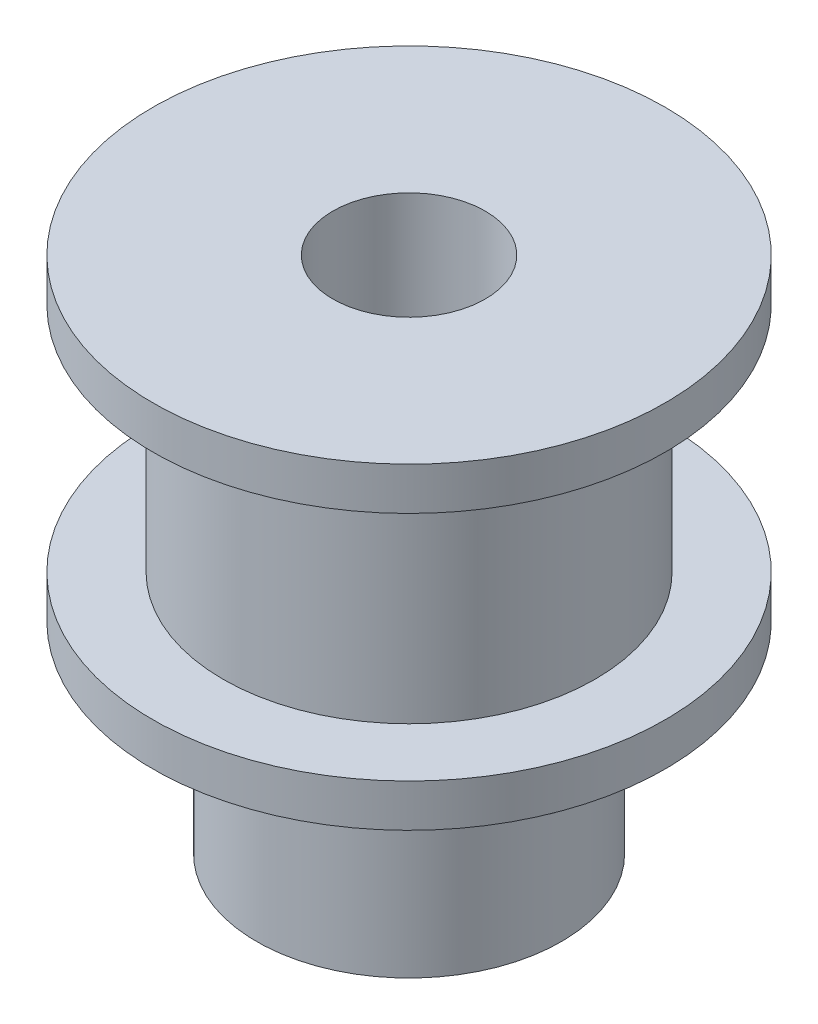
ISO-10303-21;
HEADER;
FILE_DESCRIPTION(('STEP AP214'),'2;1');
FILE_NAME('part.step','',(''),(''),'','','');
FILE_SCHEMA(('AUTOMOTIVE_DESIGN { 1 0 10303 214 1 1 1 1 }'));
ENDSEC;
DATA;
#1=APPLICATION_CONTEXT('core data for automotive mechanical design processes');
#2=APPLICATION_PROTOCOL_DEFINITION('international standard','automotive_design',2000,#1);
#3=PRODUCT_CONTEXT('',#1,'mechanical');
#4=PRODUCT('Part','Part','',(#3));
#5=PRODUCT_RELATED_PRODUCT_CATEGORY('part','',(#4));
#6=PRODUCT_DEFINITION_FORMATION('','',#4);
#7=PRODUCT_DEFINITION_CONTEXT('part definition',#1,'design');
#8=PRODUCT_DEFINITION('design','',#6,#7);
#9=PRODUCT_DEFINITION_SHAPE('','',#8);
#10=(LENGTH_UNIT() NAMED_UNIT(*) SI_UNIT(.MILLI.,.METRE.));
#11=(NAMED_UNIT(*) PLANE_ANGLE_UNIT() SI_UNIT($,.RADIAN.));
#12=(NAMED_UNIT(*) SI_UNIT($,.STERADIAN.) SOLID_ANGLE_UNIT());
#13=UNCERTAINTY_MEASURE_WITH_UNIT(LENGTH_MEASURE(1.E-05),#10,'distance_accuracy_value','');
#14=(GEOMETRIC_REPRESENTATION_CONTEXT(3) GLOBAL_UNCERTAINTY_ASSIGNED_CONTEXT((#13)) GLOBAL_UNIT_ASSIGNED_CONTEXT((#10,
#11,#12)) REPRESENTATION_CONTEXT('',''));
#15=CARTESIAN_POINT('',(0.,0.,0.));
#16=DIRECTION('',(0.,0.,1.));
#17=DIRECTION('',(1.,0.,0.));
#18=AXIS2_PLACEMENT_3D('',#15,#16,#17);
#19=CARTESIAN_POINT('',(0.,0.,0.));
#20=DIRECTION('',(0.,-1.,0.));
#21=DIRECTION('',(0.,0.,-1.));
#22=AXIS2_PLACEMENT_3D('',#19,#20,#21);
#23=CYLINDRICAL_SURFACE('',#22,2.5);
#24=CARTESIAN_POINT('',(2.16506350946109,5.,1.25000000000001));
#25=CARTESIAN_POINT('',(2.16506918410573,4.93486523975594,1.24999545384317));
#26=CARTESIAN_POINT('',(2.16804751484695,4.86964823559369,1.24487496341653));
#27=CARTESIAN_POINT('',(2.17952958065065,4.74121591915356,1.22465401237257));
#28=CARTESIAN_POINT('',(2.18804492569449,4.67800510619574,1.20953258069273));
#29=CARTESIAN_POINT('',(2.20936683256748,4.55568541957007,1.17012493587477));
#30=CARTESIAN_POINT('',(2.22215054341565,4.49655668440802,1.14588744061717));
#31=CARTESIAN_POINT('',(2.25053331021072,4.3832197475041,1.08908440672047));
#32=CARTESIAN_POINT('',(2.2661325184508,4.32901181217193,1.05651841754472));
#33=CARTESIAN_POINT('',(2.29996086321801,4.22211783930312,0.980833175663607));
#34=CARTESIAN_POINT('',(2.31830079547442,4.16992608040807,0.937065045179721));
#35=CARTESIAN_POINT('',(2.35464978482132,4.07323951449161,0.841567259518094));
#36=CARTESIAN_POINT('',(2.37265867289062,4.0287485467706,0.789833657227875));
#37=CARTESIAN_POINT('',(2.40776846191186,3.94579106106542,0.675611954268192));
#38=CARTESIAN_POINT('',(2.42472633022715,3.90793279017559,0.612633986265728));
#39=CARTESIAN_POINT('',(2.45438445124411,3.8435739334428,0.480196283249389));
#40=CARTESIAN_POINT('',(2.46708738979677,3.81706617982854,0.410740672672703));
#41=CARTESIAN_POINT('',(2.48600576555297,3.77811917337363,0.272556179907481));
#42=CARTESIAN_POINT('',(2.49261850276115,3.76481309205558,0.204127238111031));
#43=CARTESIAN_POINT('',(2.50009479807584,3.7497923516562,0.0657132858723195));
#44=CARTESIAN_POINT('',(2.50096183480737,3.74807067900536,-0.00427075730466375));
#45=CARTESIAN_POINT('',(2.49703727395563,3.75593334246294,-0.137290655529678));
#46=CARTESIAN_POINT('',(2.49273119865201,3.76454751940153,-0.20040149897098));
#47=CARTESIAN_POINT('',(2.47967806574684,3.79110105488082,-0.324142214897893));
#48=CARTESIAN_POINT('',(2.47093067582992,3.80904111122028,-0.384771901367398));
#49=CARTESIAN_POINT('',(2.44964479109568,3.85385320761227,-0.502886739461933));
#50=CARTESIAN_POINT('',(2.43705551911499,3.88084539146508,-0.560316779393964));
#51=CARTESIAN_POINT('',(2.40922057483359,3.94282927025187,-0.669971001891652));
#52=CARTESIAN_POINT('',(2.39397395196855,3.97782382912794,-0.722193311048298));
#53=CARTESIAN_POINT('',(2.36055492999037,4.05861918941627,-0.825217076122735));
#54=CARTESIAN_POINT('',(2.34224219997719,4.10512878540751,-0.875417593786692));
#55=CARTESIAN_POINT('',(2.30567925733515,4.20573715616272,-0.967630462872217));
#56=CARTESIAN_POINT('',(2.28742910332036,4.25984171534258,-1.00963651446778));
#57=CARTESIAN_POINT('',(2.25180195115606,4.37831024053011,-1.08688166830276));
#58=CARTESIAN_POINT('',(2.23455399988385,4.44310752881776,-1.12152164372256));
#59=CARTESIAN_POINT('',(2.2046931284822,4.57867208919875,-1.17914889125153));
#60=CARTESIAN_POINT('',(2.19207537557585,4.64943304127195,-1.2021483227636));
#61=CARTESIAN_POINT('',(2.17430794771293,4.78901813910349,-1.23397526378129));
#62=CARTESIAN_POINT('',(2.16864569810621,4.85755139880444,-1.24378140264996));
#63=CARTESIAN_POINT('',(2.16397399202012,4.99550167689568,-1.25189618326428));
#64=CARTESIAN_POINT('',(2.1649598361164,5.06491803639973,-1.25021294664377));
#65=CARTESIAN_POINT('',(2.17292920675731,5.19456739822341,-1.23629505417995));
#66=CARTESIAN_POINT('',(2.17924484383318,5.25497431388491,-1.22523477089058));
#67=CARTESIAN_POINT('',(2.19617526939177,5.3729597328387,-1.19462035579054));
#68=CARTESIAN_POINT('',(2.20679145006293,5.43053731343326,-1.17506347327951));
#69=CARTESIAN_POINT('',(2.23170277599571,5.54426416362837,-1.1270594857561));
#70=CARTESIAN_POINT('',(2.24614554053829,5.60022377106694,-1.0982425796159));
#71=CARTESIAN_POINT('',(2.27695149371562,5.70683658942374,-1.03285883001975));
#72=CARTESIAN_POINT('',(2.29331566693935,5.7574870543916,-0.996288005415263));
#73=CARTESIAN_POINT('',(2.3285999807042,5.85872345940443,-0.91104645899856));
#74=CARTESIAN_POINT('',(2.34758228942862,5.90849643839707,-0.861431590393701));
#75=CARTESIAN_POINT('',(2.38417793722366,5.99926529749199,-0.754255619247854));
#76=CARTESIAN_POINT('',(2.40179081259637,6.04025821278817,-0.696691843319177));
#77=CARTESIAN_POINT('',(2.43426702113696,6.11321715743763,-0.573169203198439));
#78=CARTESIAN_POINT('',(2.44904552090037,6.14491639776364,-0.507028871967634));
#79=CARTESIAN_POINT('',(2.47354193699126,6.19642237982174,-0.369402955801345));
#80=CARTESIAN_POINT('',(2.48326429595466,6.21623956420788,-0.297922126740212));
#81=CARTESIAN_POINT('',(2.49584385227353,6.24171070521833,-0.158724602913014));
#82=CARTESIAN_POINT('',(2.49924909885239,6.24849734484514,-0.0912643048130636));
#83=CARTESIAN_POINT('',(2.50052662968914,6.251054081818,0.0439074824390123));
#84=CARTESIAN_POINT('',(2.49840085083612,6.24682803565446,0.111618875368866));
#85=CARTESIAN_POINT('',(2.48917461047403,6.22822949150547,0.240672490396442));
#86=CARTESIAN_POINT('',(2.48241118334987,6.21454393842791,0.302140397264088));
#87=CARTESIAN_POINT('',(2.46490117079279,6.17834125087129,0.42180744022953));
#88=CARTESIAN_POINT('',(2.45415401415994,6.15582284988318,0.480006106194394));
#89=CARTESIAN_POINT('',(2.4290741343515,6.10159118479253,0.594279257806113));
#90=CARTESIAN_POINT('',(2.41460771498499,6.0695258459902,0.650156428375065));
#91=CARTESIAN_POINT('',(2.38360166427282,5.99755258642619,0.755968302267538));
#92=CARTESIAN_POINT('',(2.3670610819795,5.95764106360541,0.805900259268642));
#93=CARTESIAN_POINT('',(2.33160762783284,5.86650357622162,0.903642505196122));
#94=CARTESIAN_POINT('',(2.31262248764622,5.81454689065351,0.950747105674097));
#95=CARTESIAN_POINT('',(2.27578845203565,5.70318659858779,1.03582910924335));
#96=CARTESIAN_POINT('',(2.25794057202331,5.6437764739154,1.07379843751258));
#97=CARTESIAN_POINT('',(2.22499506631145,5.51670419177381,1.14053884973208));
#98=CARTESIAN_POINT('',(2.21000217820337,5.44884058608908,1.16898133245118));
#99=CARTESIAN_POINT('',(2.18582695410439,5.30833449457528,1.21359838688302));
#100=CARTESIAN_POINT('',(2.17662520184627,5.23570888885914,1.22981398896919));
#101=CARTESIAN_POINT('',(2.16911590752238,5.13524330543501,1.24295875983053));
#102=CARTESIAN_POINT('',(2.16760161256439,5.10829013200265,1.24559513120482));
#103=CARTESIAN_POINT('',(2.16557419859687,5.0542293991472,1.24911675636246));
#104=CARTESIAN_POINT('',(2.16506114656386,5.02712182951766,1.25000189299985));
#105=CARTESIAN_POINT('',(2.16506350946109,5.,1.25000000000001));
#106=B_SPLINE_CURVE_WITH_KNOTS('',3,(#24,#25,#26,#27,#28,#29,#30,#31,#32,#33,#34,#35,#36,#37,
#38,#39,#40,#41,#42,#43,#44,#45,#46,#47,#48,#49,#50,#51,#52,#53,#54,#55,#56,#57,#58,#59,#60,#61,
#62,#63,#64,#65,#66,#67,#68,#69,#70,#71,#72,#73,#74,#75,#76,#77,#78,#79,#80,#81,#82,#83,#84,#85,
#86,#87,#88,#89,#90,#91,#92,#93,#94,#95,#96,#97,#98,#99,#100,#101,#102,#103,#104,#105),
.UNSPECIFIED.,.T.,.F.,(4,2,2,2,2,2,2,2,2,2,2,2,2,2,2,2,2,2,2,2,2,2,2,2,2,2,2,2,2,2,2,2,2,2,2,2,
2,2,2,2,4),(0.,0.195290153243395,0.390991116031006,0.585660744898608,0.780340906806437,
0.991077890622793,1.20191963855464,1.42697365298454,1.65188533704864,1.86079356209919,
2.0695752960755,2.26020121855673,2.45084140646819,2.64411918413933,2.8374662418784,
3.04908989321113,3.26087560307398,3.48611052161811,3.71110967764631,3.91827863567765,
4.12530116485466,4.30967729280032,4.49411315545079,4.6870912050761,4.88016857775059,
5.09758429475766,5.31507331222753,5.53830226766207,5.76133474760965,5.96390337986859,
6.16640108492465,6.35555531089366,6.54473666890016,6.7420093839934,6.93937287625899,
7.15637802312584,7.37357428556443,7.59763436298256,7.8209391625345,7.90225168981637,
7.98356965618176),.UNSPECIFIED.);
#107=CARTESIAN_POINT('',(2.16506350946109,5.,1.25000000000001));
#108=VERTEX_POINT('',#107);
#109=EDGE_CURVE('E102',#108,#108,#106,.T.);
#110=ORIENTED_EDGE('',*,*,#109,.T.);
#111=EDGE_LOOP('',(#110));
#112=FACE_BOUND('',#111,.T.);
#113=CARTESIAN_POINT('',(1.25,5.,-2.1650635094611));
#114=CARTESIAN_POINT('',(1.24999545384316,4.93486523975594,-2.16506918410574));
#115=CARTESIAN_POINT('',(1.24487496341652,4.86964823559369,-2.16804751484696));
#116=CARTESIAN_POINT('',(1.22465401237257,4.74121591915356,-2.17952958065065));
#117=CARTESIAN_POINT('',(1.20953258069272,4.67800510619574,-2.18804492569449));
#118=CARTESIAN_POINT('',(1.17012493587477,4.55568541957007,-2.20936683256748));
#119=CARTESIAN_POINT('',(1.14588744061716,4.49655668440802,-2.22215054341565));
#120=CARTESIAN_POINT('',(1.08908440672047,4.3832197475041,-2.25053331021072));
#121=CARTESIAN_POINT('',(1.05651841754472,4.32901181217193,-2.26613251845081));
#122=CARTESIAN_POINT('',(0.980833175663598,4.22211783930312,-2.29996086321802));
#123=CARTESIAN_POINT('',(0.937065045179713,4.16992608040807,-2.31830079547442));
#124=CARTESIAN_POINT('',(0.841567259518085,4.07323951449161,-2.35464978482132));
#125=CARTESIAN_POINT('',(0.789833657227866,4.0287485467706,-2.37265867289062));
#126=CARTESIAN_POINT('',(0.675611954268182,3.94579106106542,-2.40776846191186));
#127=CARTESIAN_POINT('',(0.612633986265718,3.90793279017559,-2.42472633022716));
#128=CARTESIAN_POINT('',(0.48019628324938,3.8435739334428,-2.45438445124411));
#129=CARTESIAN_POINT('',(0.410740672672694,3.81706617982854,-2.46708738979677));
#130=CARTESIAN_POINT('',(0.272556179907472,3.77811917337363,-2.48600576555297));
#131=CARTESIAN_POINT('',(0.204127238111022,3.76481309205558,-2.49261850276115));
#132=CARTESIAN_POINT('',(0.0657132858723103,3.7497923516562,-2.50009479807584));
#133=CARTESIAN_POINT('',(-0.00427075730467304,3.74807067900536,-2.50096183480737));
#134=CARTESIAN_POINT('',(-0.137290655529687,3.75593334246294,-2.49703727395563));
#135=CARTESIAN_POINT('',(-0.200401498970989,3.76454751940153,-2.492731198652));
#136=CARTESIAN_POINT('',(-0.324142214897902,3.79110105488082,-2.47967806574684));
#137=CARTESIAN_POINT('',(-0.384771901367407,3.80904111122028,-2.47093067582992));
#138=CARTESIAN_POINT('',(-0.502886739461942,3.85385320761227,-2.44964479109568));
#139=CARTESIAN_POINT('',(-0.560316779393973,3.88084539146508,-2.43705551911499));
#140=CARTESIAN_POINT('',(-0.669971001891661,3.94282927025187,-2.40922057483359));
#141=CARTESIAN_POINT('',(-0.722193311048307,3.97782382912794,-2.39397395196855));
#142=CARTESIAN_POINT('',(-0.825217076122744,4.05861918941627,-2.36055492999036));
#143=CARTESIAN_POINT('',(-0.875417593786701,4.10512878540751,-2.34224219997719));
#144=CARTESIAN_POINT('',(-0.967630462872225,4.20573715616272,-2.30567925733515));
#145=CARTESIAN_POINT('',(-1.00963651446779,4.25984171534258,-2.28742910332036));
#146=CARTESIAN_POINT('',(-1.08688166830276,4.37831024053011,-2.25180195115606));
#147=CARTESIAN_POINT('',(-1.12152164372256,4.44310752881776,-2.23455399988384));
#148=CARTESIAN_POINT('',(-1.17914889125154,4.57867208919875,-2.2046931284822));
#149=CARTESIAN_POINT('',(-1.20214832276361,4.64943304127195,-2.19207537557584));
#150=CARTESIAN_POINT('',(-1.2339752637813,4.78901813910349,-2.17430794771293));
#151=CARTESIAN_POINT('',(-1.24378140264997,4.85755139880444,-2.1686456981062));
#152=CARTESIAN_POINT('',(-1.25189618326428,4.99550167689568,-2.16397399202012));
#153=CARTESIAN_POINT('',(-1.25021294664378,5.06491803639973,-2.16495983611639));
#154=CARTESIAN_POINT('',(-1.23629505417996,5.19456739822341,-2.17292920675731));
#155=CARTESIAN_POINT('',(-1.22523477089058,5.25497431388491,-2.17924484383318));
#156=CARTESIAN_POINT('',(-1.19462035579055,5.3729597328387,-2.19617526939176));
#157=CARTESIAN_POINT('',(-1.17506347327952,5.43053731343326,-2.20679145006292));
#158=CARTESIAN_POINT('',(-1.12705948575611,5.54426416362837,-2.23170277599571));
#159=CARTESIAN_POINT('',(-1.0982425796159,5.60022377106694,-2.24614554053829));
#160=CARTESIAN_POINT('',(-1.03285883001976,5.70683658942374,-2.27695149371562));
#161=CARTESIAN_POINT('',(-0.996288005415271,5.7574870543916,-2.29331566693934));
#162=CARTESIAN_POINT('',(-0.911046458998567,5.85872345940444,-2.3285999807042));
#163=CARTESIAN_POINT('',(-0.861431590393709,5.90849643839707,-2.34758228942861));
#164=CARTESIAN_POINT('',(-0.754255619247861,5.99926529749199,-2.38417793722366));
#165=CARTESIAN_POINT('',(-0.696691843319184,6.04025821278818,-2.40179081259637));
#166=CARTESIAN_POINT('',(-0.573169203198446,6.11321715743763,-2.43426702113696));
#167=CARTESIAN_POINT('',(-0.507028871967641,6.14491639776364,-2.44904552090037));
#168=CARTESIAN_POINT('',(-0.369402955801352,6.19642237982174,-2.47354193699126));
#169=CARTESIAN_POINT('',(-0.29792212674022,6.21623956420788,-2.48326429595466));
#170=CARTESIAN_POINT('',(-0.158724602913021,6.24171070521833,-2.49584385227353));
#171=CARTESIAN_POINT('',(-0.0912643048130714,6.24849734484514,-2.49924909885239));
#172=CARTESIAN_POINT('',(0.0439074824390044,6.251054081818,-2.50052662968914));
#173=CARTESIAN_POINT('',(0.111618875368858,6.24682803565446,-2.49840085083612));
#174=CARTESIAN_POINT('',(0.240672490396434,6.22822949150547,-2.48917461047403));
#175=CARTESIAN_POINT('',(0.30214039726408,6.21454393842791,-2.48241118334987));
#176=CARTESIAN_POINT('',(0.421807440229522,6.17834125087129,-2.46490117079279));
#177=CARTESIAN_POINT('',(0.480006106194386,6.15582284988318,-2.45415401415995));
#178=CARTESIAN_POINT('',(0.594279257806106,6.10159118479253,-2.4290741343515));
#179=CARTESIAN_POINT('',(0.650156428375059,6.0695258459902,-2.41460771498499));
#180=CARTESIAN_POINT('',(0.755968302267532,5.99755258642619,-2.38360166427283));
#181=CARTESIAN_POINT('',(0.805900259268634,5.95764106360541,-2.36706108197951));
#182=CARTESIAN_POINT('',(0.903642505196114,5.86650357622162,-2.33160762783285));
#183=CARTESIAN_POINT('',(0.95074710567409,5.81454689065351,-2.31262248764622));
#184=CARTESIAN_POINT('',(1.03582910924334,5.70318659858779,-2.27578845203565));
#185=CARTESIAN_POINT('',(1.07379843751257,5.6437764739154,-2.25794057202332));
#186=CARTESIAN_POINT('',(1.14053884973207,5.51670419177381,-2.22499506631145));
#187=CARTESIAN_POINT('',(1.16898133245117,5.44884058608908,-2.21000217820338));
#188=CARTESIAN_POINT('',(1.21359838688301,5.30833449457528,-2.18582695410439));
#189=CARTESIAN_POINT('',(1.22981398896918,5.23570888885914,-2.17662520184627));
#190=CARTESIAN_POINT('',(1.24295875983052,5.135243305435,-2.16911590752238));
#191=CARTESIAN_POINT('',(1.24559513120481,5.10829013200265,-2.1676016125644));
#192=CARTESIAN_POINT('',(1.24911675636245,5.0542293991472,-2.16557419859688));
#193=CARTESIAN_POINT('',(1.25000189299984,5.02712182951766,-2.16506114656387));
#194=CARTESIAN_POINT('',(1.25,5.,-2.1650635094611));
#195=B_SPLINE_CURVE_WITH_KNOTS('',3,(#113,#114,#115,#116,#117,#118,#119,#120,#121,#122,#123,
#124,#125,#126,#127,#128,#129,#130,#131,#132,#133,#134,#135,#136,#137,#138,#139,#140,#141,#142,
#143,#144,#145,#146,#147,#148,#149,#150,#151,#152,#153,#154,#155,#156,#157,#158,#159,#160,#161,
#162,#163,#164,#165,#166,#167,#168,#169,#170,#171,#172,#173,#174,#175,#176,#177,#178,#179,#180,
#181,#182,#183,#184,#185,#186,#187,#188,#189,#190,#191,#192,#193,#194),.UNSPECIFIED.,.T.,.F.,(4,
2,2,2,2,2,2,2,2,2,2,2,2,2,2,2,2,2,2,2,2,2,2,2,2,2,2,2,2,2,2,2,2,2,2,2,2,2,2,2,4),(0.,
0.195290153243395,0.390991116031006,0.585660744898607,0.780340906806438,0.991077890622794,
1.20191963855464,1.42697365298454,1.65188533704864,1.86079356209919,2.0695752960755,
2.26020121855673,2.45084140646819,2.64411918413933,2.8374662418784,3.04908989321113,
3.26087560307398,3.48611052161811,3.71110967764631,3.91827863567765,4.12530116485466,
4.30967729280032,4.49411315545079,4.6870912050761,4.88016857775059,5.09758429475767,
5.31507331222753,5.53830226766207,5.76133474760965,5.96390337986859,6.16640108492465,
6.35555531089366,6.54473666890016,6.7420093839934,6.93937287625899,7.15637802312585,
7.37357428556443,7.59763436298256,7.82093916253451,7.90225168981637,7.98356965618176),.UNSPECIFIED.);
#196=CARTESIAN_POINT('',(1.25,5.,-2.1650635094611));
#197=VERTEX_POINT('',#196);
#198=EDGE_CURVE('E72',#197,#197,#195,.T.);
#199=ORIENTED_EDGE('',*,*,#198,.T.);
#200=EDGE_LOOP('',(#199));
#201=FACE_BOUND('',#200,.T.);
#202=CARTESIAN_POINT('',(0.,0.,0.));
#203=DIRECTION('',(0.,-1.,0.));
#204=DIRECTION('',(0.,0.,-1.));
#205=AXIS2_PLACEMENT_3D('',#202,#203,#204);
#206=CIRCLE('',#205,2.5);
#207=CARTESIAN_POINT('',(0.,0.,-2.5));
#208=VERTEX_POINT('',#207);
#209=EDGE_CURVE('E69',#208,#208,#206,.T.);
#210=ORIENTED_EDGE('',*,*,#209,.T.);
#211=EDGE_LOOP('',(#210));
#212=FACE_BOUND('',#211,.T.);
#213=CARTESIAN_POINT('',(0.,17.,0.));
#214=DIRECTION('',(0.,-1.,0.));
#215=DIRECTION('',(0.,0.,-1.));
#216=AXIS2_PLACEMENT_3D('',#213,#214,#215);
#217=CIRCLE('',#216,2.5);
#218=CARTESIAN_POINT('',(0.,17.,-2.5));
#219=VERTEX_POINT('',#218);
#220=EDGE_CURVE('E10',#219,#219,#217,.T.);
#221=ORIENTED_EDGE('',*,*,#220,.F.);
#222=EDGE_LOOP('',(#221));
#223=FACE_BOUND('',#222,.T.);
#224=ADVANCED_FACE('F35',(#112,#201,#212,#223),#23,.F.);
#225=CARTESIAN_POINT('',(2.5,17.,0.));
#226=DIRECTION('',(0.,1.,0.));
#227=DIRECTION('',(0.,0.,1.));
#228=AXIS2_PLACEMENT_3D('',#225,#226,#227);
#229=PLANE('',#228);
#230=ORIENTED_EDGE('',*,*,#220,.T.);
#231=EDGE_LOOP('',(#230));
#232=FACE_BOUND('',#231,.T.);
#233=CARTESIAN_POINT('',(0.,17.,0.));
#234=DIRECTION('',(0.,-1.,0.));
#235=DIRECTION('',(0.,0.,-1.));
#236=AXIS2_PLACEMENT_3D('',#233,#234,#235);
#237=CIRCLE('',#236,8.4);
#238=CARTESIAN_POINT('',(0.,17.,-8.4));
#239=VERTEX_POINT('',#238);
#240=EDGE_CURVE('E41',#239,#239,#237,.T.);
#241=ORIENTED_EDGE('',*,*,#240,.F.);
#242=EDGE_LOOP('',(#241));
#243=FACE_BOUND('',#242,.T.);
#244=ADVANCED_FACE('F131',(#232,#243),#229,.T.);
#245=CARTESIAN_POINT('',(0.,0.,0.));
#246=DIRECTION('',(0.,-1.,0.));
#247=DIRECTION('',(0.,0.,-1.));
#248=AXIS2_PLACEMENT_3D('',#245,#246,#247);
#249=CYLINDRICAL_SURFACE('',#248,8.4);
#250=ORIENTED_EDGE('',*,*,#240,.T.);
#251=EDGE_LOOP('',(#250));
#252=FACE_BOUND('',#251,.T.);
#253=CARTESIAN_POINT('',(0.,15.6,0.));
#254=DIRECTION('',(0.,-1.,0.));
#255=DIRECTION('',(0.,0.,-1.));
#256=AXIS2_PLACEMENT_3D('',#253,#254,#255);
#257=CIRCLE('',#256,8.4);
#258=CARTESIAN_POINT('',(0.,15.6,-8.4));
#259=VERTEX_POINT('',#258);
#260=EDGE_CURVE('E45',#259,#259,#257,.T.);
#261=ORIENTED_EDGE('',*,*,#260,.F.);
#262=EDGE_LOOP('',(#261));
#263=FACE_BOUND('',#262,.T.);
#264=ADVANCED_FACE('F135',(#252,#263),#249,.T.);
#265=CARTESIAN_POINT('',(8.4,15.6,0.));
#266=DIRECTION('',(0.,-1.,0.));
#267=DIRECTION('',(0.,0.,-1.));
#268=AXIS2_PLACEMENT_3D('',#265,#266,#267);
#269=PLANE('',#268);
#270=ORIENTED_EDGE('',*,*,#260,.T.);
#271=EDGE_LOOP('',(#270));
#272=FACE_BOUND('',#271,.T.);
#273=CARTESIAN_POINT('',(0.,15.6,0.));
#274=DIRECTION('',(0.,-1.,0.));
#275=DIRECTION('',(0.,0.,-1.));
#276=AXIS2_PLACEMENT_3D('',#273,#274,#275);
#277=CIRCLE('',#276,6.1);
#278=CARTESIAN_POINT('',(0.,15.6,-6.1));
#279=VERTEX_POINT('',#278);
#280=EDGE_CURVE('E49',#279,#279,#277,.T.);
#281=ORIENTED_EDGE('',*,*,#280,.F.);
#282=EDGE_LOOP('',(#281));
#283=FACE_BOUND('',#282,.T.);
#284=ADVANCED_FACE('F209',(#272,#283),#269,.T.);
#285=CARTESIAN_POINT('',(0.,0.,0.));
#286=DIRECTION('',(0.,-1.,0.));
#287=DIRECTION('',(0.,0.,-1.));
#288=AXIS2_PLACEMENT_3D('',#285,#286,#287);
#289=CYLINDRICAL_SURFACE('',#288,6.1);
#290=ORIENTED_EDGE('',*,*,#280,.T.);
#291=EDGE_LOOP('',(#290));
#292=FACE_BOUND('',#291,.T.);
#293=CARTESIAN_POINT('',(0.,8.,0.));
#294=DIRECTION('',(0.,-1.,0.));
#295=DIRECTION('',(0.,0.,-1.));
#296=AXIS2_PLACEMENT_3D('',#293,#294,#295);
#297=CIRCLE('',#296,6.1);
#298=CARTESIAN_POINT('',(0.,8.,-6.1));
#299=VERTEX_POINT('',#298);
#300=EDGE_CURVE('E54',#299,#299,#297,.T.);
#301=ORIENTED_EDGE('',*,*,#300,.F.);
#302=EDGE_LOOP('',(#301));
#303=FACE_BOUND('',#302,.T.);
#304=ADVANCED_FACE('F199',(#292,#303),#289,.T.);
#305=CARTESIAN_POINT('',(6.1,8.,0.));
#306=DIRECTION('',(0.,1.,0.));
#307=DIRECTION('',(0.,0.,1.));
#308=AXIS2_PLACEMENT_3D('',#305,#306,#307);
#309=PLANE('',#308);
#310=ORIENTED_EDGE('',*,*,#300,.T.);
#311=EDGE_LOOP('',(#310));
#312=FACE_BOUND('',#311,.T.);
#313=CARTESIAN_POINT('',(0.,8.,0.));
#314=DIRECTION('',(0.,-1.,0.));
#315=DIRECTION('',(0.,0.,-1.));
#316=AXIS2_PLACEMENT_3D('',#313,#314,#315);
#317=CIRCLE('',#316,8.4);
#318=CARTESIAN_POINT('',(0.,8.,-8.4));
#319=VERTEX_POINT('',#318);
#320=EDGE_CURVE('E57',#319,#319,#317,.T.);
#321=ORIENTED_EDGE('',*,*,#320,.F.);
#322=EDGE_LOOP('',(#321));
#323=FACE_BOUND('',#322,.T.);
#324=ADVANCED_FACE('F189',(#312,#323),#309,.T.);
#325=CARTESIAN_POINT('',(0.,0.,0.));
#326=DIRECTION('',(0.,-1.,0.));
#327=DIRECTION('',(0.,0.,-1.));
#328=AXIS2_PLACEMENT_3D('',#325,#326,#327);
#329=CYLINDRICAL_SURFACE('',#328,8.4);
#330=ORIENTED_EDGE('',*,*,#320,.T.);
#331=EDGE_LOOP('',(#330));
#332=FACE_BOUND('',#331,.T.);
#333=CARTESIAN_POINT('',(0.,6.6,0.));
#334=DIRECTION('',(0.,-1.,0.));
#335=DIRECTION('',(0.,0.,-1.));
#336=AXIS2_PLACEMENT_3D('',#333,#334,#335);
#337=CIRCLE('',#336,8.4);
#338=CARTESIAN_POINT('',(0.,6.6,-8.4));
#339=VERTEX_POINT('',#338);
#340=EDGE_CURVE('E60',#339,#339,#337,.T.);
#341=ORIENTED_EDGE('',*,*,#340,.F.);
#342=EDGE_LOOP('',(#341));
#343=FACE_BOUND('',#342,.T.);
#344=ADVANCED_FACE('F179',(#332,#343),#329,.T.);
#345=CARTESIAN_POINT('',(8.4,6.6,0.));
#346=DIRECTION('',(0.,-1.,0.));
#347=DIRECTION('',(0.,0.,-1.));
#348=AXIS2_PLACEMENT_3D('',#345,#346,#347);
#349=PLANE('',#348);
#350=ORIENTED_EDGE('',*,*,#340,.T.);
#351=EDGE_LOOP('',(#350));
#352=FACE_BOUND('',#351,.T.);
#353=CARTESIAN_POINT('',(0.,6.6,0.));
#354=DIRECTION('',(0.,-1.,0.));
#355=DIRECTION('',(0.,0.,-1.));
#356=AXIS2_PLACEMENT_3D('',#353,#354,#355);
#357=CIRCLE('',#356,5.);
#358=CARTESIAN_POINT('',(0.,6.6,-5.));
#359=VERTEX_POINT('',#358);
#360=EDGE_CURVE('E63',#359,#359,#357,.T.);
#361=ORIENTED_EDGE('',*,*,#360,.F.);
#362=EDGE_LOOP('',(#361));
#363=FACE_BOUND('',#362,.T.);
#364=ADVANCED_FACE('F117',(#352,#363),#349,.T.);
#365=CARTESIAN_POINT('',(0.,0.,0.));
#366=DIRECTION('',(0.,-1.,0.));
#367=DIRECTION('',(0.,0.,-1.));
#368=AXIS2_PLACEMENT_3D('',#365,#366,#367);
#369=CYLINDRICAL_SURFACE('',#368,5.);
#370=CARTESIAN_POINT('',(4.84122918275927,5.,1.25000000000002));
#371=CARTESIAN_POINT('',(4.84123050042654,5.0690253754623,1.24999803929591));
#372=CARTESIAN_POINT('',(4.84272153006956,5.138072449339,1.24426312274867));
#373=CARTESIAN_POINT('',(4.84850930996624,5.27418378908702,1.22151156273209));
#374=CARTESIAN_POINT('',(4.85280769310906,5.34124687723416,1.20448835337112));
#375=CARTESIAN_POINT('',(4.86369362297983,5.47140176909352,1.15974559981599));
#376=CARTESIAN_POINT('',(4.87027821345204,5.53449857769284,1.13203986392725));
#377=CARTESIAN_POINT('',(4.88499096014404,5.65515542626996,1.06676057063072));
#378=CARTESIAN_POINT('',(4.89311918189251,5.71271523104011,1.02918659428036));
#379=CARTESIAN_POINT('',(4.91020358177805,5.8219308226311,0.944354213655954));
#380=CARTESIAN_POINT('',(4.91917298811515,5.87344680017502,0.896918443852042));
#381=CARTESIAN_POINT('',(4.93681437757648,5.96788069718017,0.794091032050349));
#382=CARTESIAN_POINT('',(4.94548633283194,6.01079781281087,0.738698647090171));
#383=CARTESIAN_POINT('',(4.96170207760291,6.08738773381564,0.620572600539494));
#384=CARTESIAN_POINT('',(4.96922843700296,6.12092319408073,0.557747288097577));
#385=CARTESIAN_POINT('',(4.98215405962992,6.17690482207654,0.427131592146399));
#386=CARTESIAN_POINT('',(4.98755363667172,6.19935262595776,0.359341942895988));
#387=CARTESIAN_POINT('',(4.9955237942409,6.23207391728929,0.222179379377098));
#388=CARTESIAN_POINT('',(4.99814946922157,6.24258482216329,0.152866359774505));
#389=CARTESIAN_POINT('',(5.00046797053649,6.25187918963778,0.0134144096314023));
#390=CARTESIAN_POINT('',(5.00016123048352,6.2506643861048,-0.0567243972690167));
#391=CARTESIAN_POINT('',(4.99669047476767,6.23671257487493,-0.194190308965467));
#392=CARTESIAN_POINT('',(4.99359001170437,6.22423183747307,-0.261545269501316));
#393=CARTESIAN_POINT('',(4.98495418262427,6.18851436497575,-0.393172809267091));
#394=CARTESIAN_POINT('',(4.97941868699221,6.1652770573113,-0.45744522421303));
#395=CARTESIAN_POINT('',(4.96643754850448,6.10849871465647,-0.581758379377241));
#396=CARTESIAN_POINT('',(4.95897509847527,6.07486647766913,-0.641755637208114));
#397=CARTESIAN_POINT('',(4.94294951904825,5.99832216044187,-0.755344527925594));
#398=CARTESIAN_POINT('',(4.93438619826245,5.95540846571969,-0.808935043856865));
#399=CARTESIAN_POINT('',(4.91681856884761,5.86014562900881,-0.909717543856178));
#400=CARTESIAN_POINT('',(4.90780859762959,5.80757255382611,-0.956697098843982));
#401=CARTESIAN_POINT('',(4.89057521758354,5.69520001322987,-1.04122046995376));
#402=CARTESIAN_POINT('',(4.88235184552986,5.6354002102545,-1.0787638450575));
#403=CARTESIAN_POINT('',(4.86760248415825,5.50985498292552,-1.14348516127823));
#404=CARTESIAN_POINT('',(4.86108491862861,5.4440821348434,-1.1706119587131));
#405=CARTESIAN_POINT('',(4.85059320069979,5.30870726596177,-1.21335702579541));
#406=CARTESIAN_POINT('',(4.8466185040511,5.23910606800843,-1.22897775819112));
#407=CARTESIAN_POINT('',(4.84177678019571,5.10002024923844,-1.24791481933257));
#408=CARTESIAN_POINT('',(4.84083044546825,5.03058110333519,-1.2515452369598));
#409=CARTESIAN_POINT('',(4.8419367174052,4.89208903171092,-1.24725849525776));
#410=CARTESIAN_POINT('',(4.84398904800633,4.82303607102438,-1.23934239892438));
#411=CARTESIAN_POINT('',(4.85078540977281,4.68844286752265,-1.21246273196881));
#412=CARTESIAN_POINT('',(4.85548485117188,4.62286363671458,-1.19368203414086));
#413=CARTESIAN_POINT('',(4.86700359135482,4.49578427107416,-1.14580904083529));
#414=CARTESIAN_POINT('',(4.87382314124307,4.43428462047233,-1.11671552385626));
#415=CARTESIAN_POINT('',(4.88898068546632,4.31577936106633,-1.04838533396826));
#416=CARTESIAN_POINT('',(4.89734584303321,4.25888557997845,-1.0089608769178));
#417=CARTESIAN_POINT('',(4.91458541535858,4.15240581859932,-0.921325366168052));
#418=CARTESIAN_POINT('',(4.92345991364235,4.10282104167496,-0.873112868506782));
#419=CARTESIAN_POINT('',(4.94098701515803,4.01109447871452,-0.76782840123089));
#420=CARTESIAN_POINT('',(4.94962851030918,3.96916996872559,-0.710564940664473));
#421=CARTESIAN_POINT('',(4.96548608306867,3.89553206652438,-0.589628353368327));
#422=CARTESIAN_POINT('',(4.9727022350198,3.8638181416959,-0.525955561196972));
#423=CARTESIAN_POINT('',(4.98485057869157,3.81177698273603,-0.394447752163845));
#424=CARTESIAN_POINT('',(4.98979915011205,3.79136785781047,-0.326646726284834));
#425=CARTESIAN_POINT('',(4.99692646697894,3.76226983269579,-0.188437200398492));
#426=CARTESIAN_POINT('',(4.99910574696704,3.75357867063047,-0.118029206301537));
#427=CARTESIAN_POINT('',(5.00042711761014,3.74829051303058,0.0213544080541753));
#428=CARTESIAN_POINT('',(4.9996497360001,3.75137286363076,0.0903172837075587));
#429=CARTESIAN_POINT('',(4.9953237057178,3.76880978411791,0.226709370518442));
#430=CARTESIAN_POINT('',(4.99177513946369,3.78316401876638,0.294138627226125));
#431=CARTESIAN_POINT('',(4.98231791067453,3.82256527471366,0.425213794556037));
#432=CARTESIAN_POINT('',(4.97642205628333,3.84755431664328,0.488878118226291));
#433=CARTESIAN_POINT('',(4.9628911114173,3.90746322377416,0.611146316301853));
#434=CARTESIAN_POINT('',(4.9552558017217,3.94238434083696,0.669749551581331));
#435=CARTESIAN_POINT('',(4.93884062101666,4.02214404249634,0.781752410529891));
#436=CARTESIAN_POINT('',(4.93003771182014,4.06720017863422,0.834993735375747));
#437=CARTESIAN_POINT('',(4.91238311316552,4.16552856496725,0.933268775339085));
#438=CARTESIAN_POINT('',(4.90353141190695,4.21880289512238,0.978300406335254));
#439=CARTESIAN_POINT('',(4.88659344825685,4.33325176775166,1.05970253309905));
#440=CARTESIAN_POINT('',(4.87852454662355,4.39455515426578,1.0958957743082));
#441=CARTESIAN_POINT('',(4.86429944438269,4.52256936240338,1.1574086207696));
#442=CARTESIAN_POINT('',(4.85814185308378,4.58927620763343,1.18273613719967));
#443=CARTESIAN_POINT('',(4.84939885924729,4.7132212647834,1.21802816070682));
#444=CARTESIAN_POINT('',(4.84635828750683,4.76986645547982,1.22999146324424));
#445=CARTESIAN_POINT('',(4.84227298231965,4.88433608624995,1.2459778657166));
#446=CARTESIAN_POINT('',(4.84122807862453,4.94216042530633,1.25000164296525));
#447=CARTESIAN_POINT('',(4.84122918275927,5.,1.25000000000002));
#448=B_SPLINE_CURVE_WITH_KNOTS('',3,(#370,#371,#372,#373,#374,#375,#376,#377,#378,#379,#380,
#381,#382,#383,#384,#385,#386,#387,#388,#389,#390,#391,#392,#393,#394,#395,#396,#397,#398,#399,
#400,#401,#402,#403,#404,#405,#406,#407,#408,#409,#410,#411,#412,#413,#414,#415,#416,#417,#418,
#419,#420,#421,#422,#423,#424,#425,#426,#427,#428,#429,#430,#431,#432,#433,#434,#435,#436,#437,
#438,#439,#440,#441,#442,#443,#444,#445,#446,#447),.UNSPECIFIED.,.T.,.F.,(4,2,2,2,2,2,2,2,2,2,2,
2,2,2,2,2,2,2,2,2,2,2,2,2,2,2,2,2,2,2,2,2,2,2,2,2,2,2,4),(0.,0.206863720868067,
0.413847870714333,0.620565363583011,0.827291633777393,1.03811977096488,1.24896760739933,
1.4627574819896,1.67651579923546,1.88594375497673,2.0953407433301,2.30009131344474,
2.50485278362393,2.71146437127222,2.91811192734457,3.13035233285956,3.34260265599901,
3.55588216004201,3.76911600064774,3.97671787380859,4.18430063591901,4.38848702504604,
4.59269760710709,4.80091422929579,5.00916509442522,5.2226266548266,5.43607707859777,
5.64796036403465,5.85980274454519,6.06591723063728,6.27202558688491,6.47702438279856,
6.68204902869036,6.89198548291035,7.10197515782755,7.31588238642339,7.5296336068331,
7.70298913588665,7.8763298754976),.UNSPECIFIED.);
#449=CARTESIAN_POINT('',(4.84122918275927,5.,1.25000000000002));
#450=VERTEX_POINT('',#449);
#451=EDGE_CURVE('E99',#450,#450,#448,.T.);
#452=ORIENTED_EDGE('',*,*,#451,.T.);
#453=EDGE_LOOP('',(#452));
#454=FACE_BOUND('',#453,.T.);
#455=CARTESIAN_POINT('',(1.25,5.,-4.84122918275927));
#456=CARTESIAN_POINT('',(1.24999803929589,5.0690253754623,-4.84123050042654));
#457=CARTESIAN_POINT('',(1.24426312274865,5.138072449339,-4.84272153006957));
#458=CARTESIAN_POINT('',(1.22151156273207,5.27418378908702,-4.84850930996624));
#459=CARTESIAN_POINT('',(1.2044883533711,5.34124687723416,-4.85280769310907));
#460=CARTESIAN_POINT('',(1.15974559981597,5.47140176909352,-4.86369362297984));
#461=CARTESIAN_POINT('',(1.13203986392723,5.53449857769284,-4.87027821345204));
#462=CARTESIAN_POINT('',(1.0667605706307,5.65515542626996,-4.88499096014404));
#463=CARTESIAN_POINT('',(1.02918659428035,5.71271523104011,-4.89311918189251));
#464=CARTESIAN_POINT('',(0.944354213655937,5.8219308226311,-4.91020358177806));
#465=CARTESIAN_POINT('',(0.896918443852024,5.87344680017502,-4.91917298811515));
#466=CARTESIAN_POINT('',(0.794091032050331,5.96788069718017,-4.93681437757649));
#467=CARTESIAN_POINT('',(0.738698647090152,6.01079781281087,-4.94548633283195));
#468=CARTESIAN_POINT('',(0.620572600539476,6.08738773381564,-4.96170207760291));
#469=CARTESIAN_POINT('',(0.557747288097559,6.12092319408073,-4.96922843700296));
#470=CARTESIAN_POINT('',(0.427131592146381,6.17690482207654,-4.98215405962992));
#471=CARTESIAN_POINT('',(0.35934194289597,6.19935262595776,-4.98755363667172));
#472=CARTESIAN_POINT('',(0.222179379377081,6.23207391728929,-4.9955237942409));
#473=CARTESIAN_POINT('',(0.152866359774488,6.24258482216329,-4.99814946922157));
#474=CARTESIAN_POINT('',(0.0134144096313846,6.25187918963778,-5.00046797053649));
#475=CARTESIAN_POINT('',(-0.0567243972690342,6.2506643861048,-5.00016123048352));
#476=CARTESIAN_POINT('',(-0.194190308965484,6.23671257487493,-4.99669047476767));
#477=CARTESIAN_POINT('',(-0.261545269501334,6.22423183747307,-4.99359001170437));
#478=CARTESIAN_POINT('',(-0.393172809267108,6.18851436497575,-4.98495418262427));
#479=CARTESIAN_POINT('',(-0.457445224213047,6.1652770573113,-4.97941868699221));
#480=CARTESIAN_POINT('',(-0.581758379377258,6.10849871465647,-4.96643754850448));
#481=CARTESIAN_POINT('',(-0.64175563720813,6.07486647766913,-4.95897509847527));
#482=CARTESIAN_POINT('',(-0.755344527925611,5.99832216044187,-4.94294951904825));
#483=CARTESIAN_POINT('',(-0.808935043856882,5.95540846571969,-4.93438619826245));
#484=CARTESIAN_POINT('',(-0.909717543856195,5.86014562900881,-4.9168185688476));
#485=CARTESIAN_POINT('',(-0.956697098843999,5.80757255382611,-4.90780859762959));
#486=CARTESIAN_POINT('',(-1.04122046995377,5.69520001322987,-4.89057521758353));
#487=CARTESIAN_POINT('',(-1.07876384505752,5.6354002102545,-4.88235184552985));
#488=CARTESIAN_POINT('',(-1.14348516127825,5.50985498292552,-4.86760248415824));
#489=CARTESIAN_POINT('',(-1.17061195871311,5.4440821348434,-4.8610849186286));
#490=CARTESIAN_POINT('',(-1.21335702579543,5.30870726596177,-4.85059320069979));
#491=CARTESIAN_POINT('',(-1.22897775819114,5.23910606800843,-4.84661850405109));
#492=CARTESIAN_POINT('',(-1.24791481933259,5.10002024923844,-4.8417767801957));
#493=CARTESIAN_POINT('',(-1.25154523695981,5.03058110333519,-4.84083044546824));
#494=CARTESIAN_POINT('',(-1.24725849525777,4.89208903171092,-4.8419367174052));
#495=CARTESIAN_POINT('',(-1.2393423989244,4.82303607102438,-4.84398904800633));
#496=CARTESIAN_POINT('',(-1.21246273196883,4.68844286752265,-4.8507854097728));
#497=CARTESIAN_POINT('',(-1.19368203414087,4.62286363671458,-4.85548485117188));
#498=CARTESIAN_POINT('',(-1.14580904083531,4.49578427107416,-4.86700359135481));
#499=CARTESIAN_POINT('',(-1.11671552385627,4.43428462047233,-4.87382314124307));
#500=CARTESIAN_POINT('',(-1.04838533396828,4.31577936106633,-4.88898068546631));
#501=CARTESIAN_POINT('',(-1.00896087691781,4.25888557997845,-4.89734584303321));
#502=CARTESIAN_POINT('',(-0.921325366168069,4.15240581859932,-4.91458541535858));
#503=CARTESIAN_POINT('',(-0.873112868506799,4.10282104167496,-4.92345991364235));
#504=CARTESIAN_POINT('',(-0.767828401230907,4.01109447871452,-4.94098701515803));
#505=CARTESIAN_POINT('',(-0.710564940664491,3.96916996872559,-4.94962851030918));
#506=CARTESIAN_POINT('',(-0.589628353368344,3.89553206652438,-4.96548608306867));
#507=CARTESIAN_POINT('',(-0.525955561196989,3.8638181416959,-4.9727022350198));
#508=CARTESIAN_POINT('',(-0.394447752163863,3.81177698273603,-4.98485057869157));
#509=CARTESIAN_POINT('',(-0.326646726284852,3.79136785781047,-4.98979915011205));
#510=CARTESIAN_POINT('',(-0.18843720039851,3.76226983269579,-4.99692646697894));
#511=CARTESIAN_POINT('',(-0.118029206301555,3.75357867063047,-4.99910574696704));
#512=CARTESIAN_POINT('',(0.0213544080541577,3.74829051303058,-5.00042711761014));
#513=CARTESIAN_POINT('',(0.090317283707541,3.75137286363076,-4.99964973600011));
#514=CARTESIAN_POINT('',(0.226709370518424,3.76880978411791,-4.9953237057178));
#515=CARTESIAN_POINT('',(0.294138627226108,3.78316401876638,-4.99177513946369));
#516=CARTESIAN_POINT('',(0.42521379455602,3.82256527471366,-4.98231791067453));
#517=CARTESIAN_POINT('',(0.488878118226274,3.84755431664328,-4.97642205628333));
#518=CARTESIAN_POINT('',(0.611146316301836,3.90746322377416,-4.9628911114173));
#519=CARTESIAN_POINT('',(0.669749551581314,3.94238434083696,-4.9552558017217));
#520=CARTESIAN_POINT('',(0.781752410529874,4.02214404249634,-4.93884062101666));
#521=CARTESIAN_POINT('',(0.83499373537573,4.06720017863422,-4.93003771182014));
#522=CARTESIAN_POINT('',(0.933268775339069,4.16552856496725,-4.91238311316553));
#523=CARTESIAN_POINT('',(0.978300406335237,4.21880289512238,-4.90353141190695));
#524=CARTESIAN_POINT('',(1.05970253309904,4.33325176775166,-4.88659344825685));
#525=CARTESIAN_POINT('',(1.09589577430819,4.39455515426578,-4.87852454662356));
#526=CARTESIAN_POINT('',(1.15740862076958,4.52256936240338,-4.8642994443827));
#527=CARTESIAN_POINT('',(1.18273613719965,4.58927620763343,-4.85814185308379));
#528=CARTESIAN_POINT('',(1.2180281607068,4.7132212647834,-4.84939885924729));
#529=CARTESIAN_POINT('',(1.22999146324422,4.76986645547983,-4.84635828750683));
#530=CARTESIAN_POINT('',(1.24597786571659,4.88433608624995,-4.84227298231965));
#531=CARTESIAN_POINT('',(1.25000164296523,4.94216042530633,-4.84122807862454));
#532=CARTESIAN_POINT('',(1.25,5.,-4.84122918275927));
#533=B_SPLINE_CURVE_WITH_KNOTS('',3,(#455,#456,#457,#458,#459,#460,#461,#462,#463,#464,#465,
#466,#467,#468,#469,#470,#471,#472,#473,#474,#475,#476,#477,#478,#479,#480,#481,#482,#483,#484,
#485,#486,#487,#488,#489,#490,#491,#492,#493,#494,#495,#496,#497,#498,#499,#500,#501,#502,#503,
#504,#505,#506,#507,#508,#509,#510,#511,#512,#513,#514,#515,#516,#517,#518,#519,#520,#521,#522,
#523,#524,#525,#526,#527,#528,#529,#530,#531,#532),.UNSPECIFIED.,.T.,.F.,(4,2,2,2,2,2,2,2,2,2,2,
2,2,2,2,2,2,2,2,2,2,2,2,2,2,2,2,2,2,2,2,2,2,2,2,2,2,2,4),(0.,0.206863720868067,
0.413847870714333,0.620565363583011,0.827291633777393,1.03811977096488,1.24896760739933,
1.4627574819896,1.67651579923546,1.88594375497673,2.0953407433301,2.30009131344474,
2.50485278362393,2.71146437127222,2.91811192734457,3.13035233285956,3.34260265599901,
3.55588216004201,3.76911600064774,3.97671787380859,4.18430063591901,4.38848702504604,
4.59269760710709,4.80091422929579,5.00916509442522,5.2226266548266,5.43607707859777,
5.64796036403465,5.85980274454519,6.06591723063729,6.27202558688491,6.47702438279856,
6.68204902869036,6.89198548291036,7.10197515782755,7.31588238642339,7.5296336068331,
7.70298913588665,7.87632987549761),.UNSPECIFIED.);
#534=CARTESIAN_POINT('',(1.25,5.,-4.84122918275927));
#535=VERTEX_POINT('',#534);
#536=EDGE_CURVE('E79',#535,#535,#533,.T.);
#537=ORIENTED_EDGE('',*,*,#536,.T.);
#538=EDGE_LOOP('',(#537));
#539=FACE_BOUND('',#538,.T.);
#540=ORIENTED_EDGE('',*,*,#360,.T.);
#541=EDGE_LOOP('',(#540));
#542=FACE_BOUND('',#541,.T.);
#543=CARTESIAN_POINT('',(0.,0.,0.));
#544=DIRECTION('',(0.,-1.,0.));
#545=DIRECTION('',(0.,0.,-1.));
#546=AXIS2_PLACEMENT_3D('',#543,#544,#545);
#547=CIRCLE('',#546,5.);
#548=CARTESIAN_POINT('',(0.,0.,-5.));
#549=VERTEX_POINT('',#548);
#550=EDGE_CURVE('E66',#549,#549,#547,.T.);
#551=ORIENTED_EDGE('',*,*,#550,.F.);
#552=EDGE_LOOP('',(#551));
#553=FACE_BOUND('',#552,.T.);
#554=ADVANCED_FACE('F112',(#454,#539,#542,#553),#369,.T.);
#555=CARTESIAN_POINT('',(5.,0.,0.));
#556=DIRECTION('',(0.,-1.,0.));
#557=DIRECTION('',(0.,0.,-1.));
#558=AXIS2_PLACEMENT_3D('',#555,#556,#557);
#559=PLANE('',#558);
#560=ORIENTED_EDGE('',*,*,#550,.T.);
#561=EDGE_LOOP('',(#560));
#562=FACE_BOUND('',#561,.T.);
#563=ORIENTED_EDGE('',*,*,#209,.F.);
#564=EDGE_LOOP('',(#563));
#565=FACE_BOUND('',#564,.T.);
#566=ADVANCED_FACE('F116',(#562,#565),#559,.T.);
#567=CARTESIAN_POINT('',(0.,5.,-8.401));
#568=DIRECTION('',(0.,0.,1.));
#569=DIRECTION('',(1.,0.,0.));
#570=AXIS2_PLACEMENT_3D('',#567,#568,#569);
#571=CYLINDRICAL_SURFACE('',#570,1.25);
#572=ORIENTED_EDGE('',*,*,#198,.F.);
#573=EDGE_LOOP('',(#572));
#574=FACE_BOUND('',#573,.T.);
#575=ORIENTED_EDGE('',*,*,#536,.F.);
#576=EDGE_LOOP('',(#575));
#577=FACE_BOUND('',#576,.T.);
#578=ADVANCED_FACE('F84',(#574,#577),#571,.F.);
#579=CARTESIAN_POINT('',(8.40100000000003,5.,0.));
#580=DIRECTION('',(-1.,0.,0.));
#581=DIRECTION('',(0.,0.,1.));
#582=AXIS2_PLACEMENT_3D('',#579,#580,#581);
#583=CYLINDRICAL_SURFACE('',#582,1.25);
#584=ORIENTED_EDGE('',*,*,#109,.F.);
#585=EDGE_LOOP('',(#584));
#586=FACE_BOUND('',#585,.T.);
#587=ORIENTED_EDGE('',*,*,#451,.F.);
#588=EDGE_LOOP('',(#587));
#589=FACE_BOUND('',#588,.T.);
#590=ADVANCED_FACE('F90',(#586,#589),#583,.F.);
#591=CLOSED_SHELL('',(#224,#244,#264,#284,#304,#324,#344,#364,#554,#566,#578,#590));
#592=MANIFOLD_SOLID_BREP('B2',#591);
#593=ADVANCED_BREP_SHAPE_REPRESENTATION('',(#18,#592),#14);
#594=SHAPE_DEFINITION_REPRESENTATION(#9,#593);
ENDSEC;
END-ISO-10303-21;
